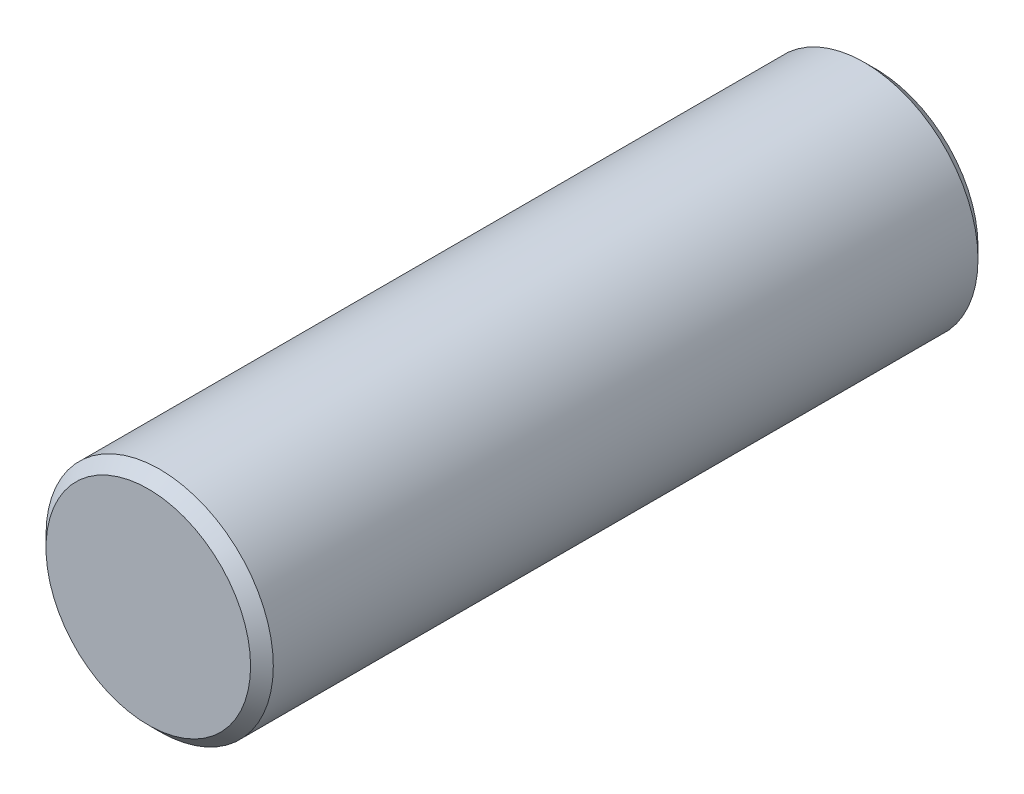
ISO-10303-21;
HEADER;
FILE_DESCRIPTION(('STEP AP214'),'2;1');
FILE_NAME('part.step','',(''),(''),'','','');
FILE_SCHEMA(('AUTOMOTIVE_DESIGN { 1 0 10303 214 1 1 1 1 }'));
ENDSEC;
DATA;
#1=APPLICATION_CONTEXT('core data for automotive mechanical design processes');
#2=APPLICATION_PROTOCOL_DEFINITION('international standard','automotive_design',2000,#1);
#3=PRODUCT_CONTEXT('',#1,'mechanical');
#4=PRODUCT('Part','Part','',(#3));
#5=PRODUCT_RELATED_PRODUCT_CATEGORY('part','',(#4));
#6=PRODUCT_DEFINITION_FORMATION('','',#4);
#7=PRODUCT_DEFINITION_CONTEXT('part definition',#1,'design');
#8=PRODUCT_DEFINITION('design','',#6,#7);
#9=PRODUCT_DEFINITION_SHAPE('','',#8);
#10=(LENGTH_UNIT() NAMED_UNIT(*) SI_UNIT(.MILLI.,.METRE.));
#11=(NAMED_UNIT(*) PLANE_ANGLE_UNIT() SI_UNIT($,.RADIAN.));
#12=(NAMED_UNIT(*) SI_UNIT($,.STERADIAN.) SOLID_ANGLE_UNIT());
#13=UNCERTAINTY_MEASURE_WITH_UNIT(LENGTH_MEASURE(1.E-05),#10,'distance_accuracy_value','');
#14=(GEOMETRIC_REPRESENTATION_CONTEXT(3) GLOBAL_UNCERTAINTY_ASSIGNED_CONTEXT((#13)) GLOBAL_UNIT_ASSIGNED_CONTEXT((#10,
#11,#12)) REPRESENTATION_CONTEXT('',''));
#15=CARTESIAN_POINT('',(0.,0.,0.));
#16=DIRECTION('',(0.,0.,1.));
#17=DIRECTION('',(1.,0.,0.));
#18=AXIS2_PLACEMENT_3D('',#15,#16,#17);
#19=CARTESIAN_POINT('',(0.,0.,8.));
#20=DIRECTION('',(0.,0.,-1.));
#21=DIRECTION('',(-1.,0.,0.));
#22=AXIS2_PLACEMENT_3D('',#19,#20,#21);
#23=CYLINDRICAL_SURFACE('',#22,2.5);
#24=CARTESIAN_POINT('',(0.,0.,-7.74999999999999));
#25=DIRECTION('',(0.,0.,1.));
#26=DIRECTION('',(1.,0.,0.));
#27=AXIS2_PLACEMENT_3D('',#24,#25,#26);
#28=CIRCLE('',#27,2.5);
#29=CARTESIAN_POINT('',(2.5,0.,-7.74999999999999));
#30=VERTEX_POINT('',#29);
#31=EDGE_CURVE('E47',#30,#30,#28,.T.);
#32=ORIENTED_EDGE('',*,*,#31,.T.);
#33=EDGE_LOOP('',(#32));
#34=FACE_BOUND('',#33,.T.);
#35=CARTESIAN_POINT('',(0.,0.,7.75));
#36=DIRECTION('',(0.,0.,1.));
#37=DIRECTION('',(1.,0.,0.));
#38=AXIS2_PLACEMENT_3D('',#35,#36,#37);
#39=CIRCLE('',#38,2.5);
#40=CARTESIAN_POINT('',(2.5,0.,7.75));
#41=VERTEX_POINT('',#40);
#42=EDGE_CURVE('E51',#41,#41,#39,.F.);
#43=ORIENTED_EDGE('',*,*,#42,.T.);
#44=EDGE_LOOP('',(#43));
#45=FACE_BOUND('',#44,.T.);
#46=ADVANCED_FACE('F35',(#34,#45),#23,.T.);
#47=CARTESIAN_POINT('',(0.,0.,8.));
#48=DIRECTION('',(0.,0.,1.));
#49=DIRECTION('',(1.,0.,0.));
#50=AXIS2_PLACEMENT_3D('',#47,#48,#49);
#51=PLANE('',#50);
#52=CARTESIAN_POINT('',(0.,0.,8.));
#53=DIRECTION('',(0.,0.,1.));
#54=DIRECTION('',(1.,0.,0.));
#55=AXIS2_PLACEMENT_3D('',#52,#53,#54);
#56=CIRCLE('',#55,2.25);
#57=CARTESIAN_POINT('',(2.25,0.,8.));
#58=VERTEX_POINT('',#57);
#59=EDGE_CURVE('E10',#58,#58,#56,.T.);
#60=ORIENTED_EDGE('',*,*,#59,.T.);
#61=EDGE_LOOP('',(#60));
#62=FACE_BOUND('',#61,.T.);
#63=ADVANCED_FACE('F67',(#62),#51,.T.);
#64=CARTESIAN_POINT('',(0.,0.,-8.));
#65=DIRECTION('',(0.,0.,1.));
#66=DIRECTION('',(1.,0.,0.));
#67=AXIS2_PLACEMENT_3D('',#64,#65,#66);
#68=PLANE('',#67);
#69=CARTESIAN_POINT('',(0.,0.,-8.));
#70=DIRECTION('',(0.,0.,1.));
#71=DIRECTION('',(1.,0.,0.));
#72=AXIS2_PLACEMENT_3D('',#69,#70,#71);
#73=CIRCLE('',#72,2.24999999999999);
#74=CARTESIAN_POINT('',(2.24999999999999,0.,-8.));
#75=VERTEX_POINT('',#74);
#76=EDGE_CURVE('E43',#75,#75,#73,.F.);
#77=ORIENTED_EDGE('',*,*,#76,.T.);
#78=EDGE_LOOP('',(#77));
#79=FACE_BOUND('',#78,.T.);
#80=ADVANCED_FACE('F64',(#79),#68,.F.);
#81=CARTESIAN_POINT('',(0.,0.,-7.74999999999999));
#82=DIRECTION('',(0.,0.,1.));
#83=DIRECTION('',(1.,0.,0.));
#84=AXIS2_PLACEMENT_3D('',#81,#82,#83);
#85=CONICAL_SURFACE('',#84,2.5,0.78539816339745);
#86=ORIENTED_EDGE('',*,*,#76,.F.);
#87=EDGE_LOOP('',(#86));
#88=FACE_BOUND('',#87,.T.);
#89=ORIENTED_EDGE('',*,*,#31,.F.);
#90=EDGE_LOOP('',(#89));
#91=FACE_BOUND('',#90,.T.);
#92=ADVANCED_FACE('F60',(#88,#91),#85,.T.);
#93=CARTESIAN_POINT('',(0.,0.,8.));
#94=DIRECTION('',(0.,0.,-1.));
#95=DIRECTION('',(-1.,0.,0.));
#96=AXIS2_PLACEMENT_3D('',#93,#94,#95);
#97=CONICAL_SURFACE('',#96,2.25,0.785398163397448);
#98=ORIENTED_EDGE('',*,*,#42,.F.);
#99=EDGE_LOOP('',(#98));
#100=FACE_BOUND('',#99,.T.);
#101=ORIENTED_EDGE('',*,*,#59,.F.);
#102=EDGE_LOOP('',(#101));
#103=FACE_BOUND('',#102,.T.);
#104=ADVANCED_FACE('F38',(#100,#103),#97,.T.);
#105=CLOSED_SHELL('',(#46,#63,#80,#92,#104));
#106=MANIFOLD_SOLID_BREP('B2',#105);
#107=ADVANCED_BREP_SHAPE_REPRESENTATION('',(#18,#106),#14);
#108=SHAPE_DEFINITION_REPRESENTATION(#9,#107);
ENDSEC;
END-ISO-10303-21;
